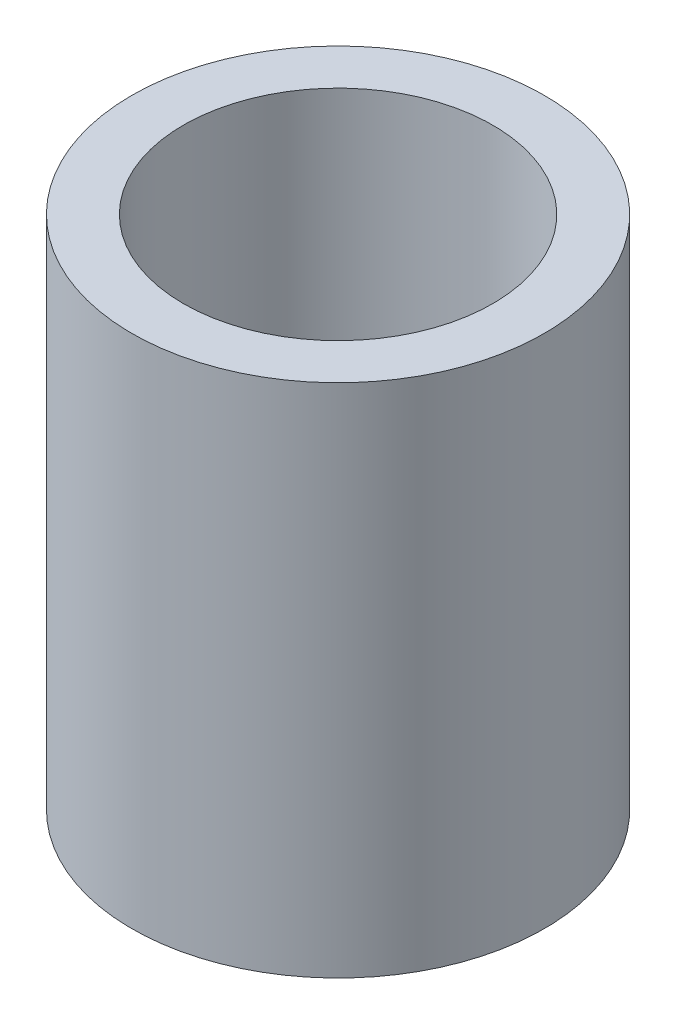
ISO-10303-21;
HEADER;
FILE_DESCRIPTION(('STEP AP214'),'2;1');
FILE_NAME('part.step','',(''),(''),'','','');
FILE_SCHEMA(('AUTOMOTIVE_DESIGN { 1 0 10303 214 1 1 1 1 }'));
ENDSEC;
DATA;
#1=APPLICATION_CONTEXT('core data for automotive mechanical design processes');
#2=APPLICATION_PROTOCOL_DEFINITION('international standard','automotive_design',2000,#1);
#3=PRODUCT_CONTEXT('',#1,'mechanical');
#4=PRODUCT('Part','Part','',(#3));
#5=PRODUCT_RELATED_PRODUCT_CATEGORY('part','',(#4));
#6=PRODUCT_DEFINITION_FORMATION('','',#4);
#7=PRODUCT_DEFINITION_CONTEXT('part definition',#1,'design');
#8=PRODUCT_DEFINITION('design','',#6,#7);
#9=PRODUCT_DEFINITION_SHAPE('','',#8);
#10=(LENGTH_UNIT() NAMED_UNIT(*) SI_UNIT(.MILLI.,.METRE.));
#11=(NAMED_UNIT(*) PLANE_ANGLE_UNIT() SI_UNIT($,.RADIAN.));
#12=(NAMED_UNIT(*) SI_UNIT($,.STERADIAN.) SOLID_ANGLE_UNIT());
#13=UNCERTAINTY_MEASURE_WITH_UNIT(LENGTH_MEASURE(1.E-05),#10,'distance_accuracy_value','');
#14=(GEOMETRIC_REPRESENTATION_CONTEXT(3) GLOBAL_UNCERTAINTY_ASSIGNED_CONTEXT((#13)) GLOBAL_UNIT_ASSIGNED_CONTEXT((#10,
#11,#12)) REPRESENTATION_CONTEXT('',''));
#15=CARTESIAN_POINT('',(0.,0.,0.));
#16=DIRECTION('',(0.,0.,1.));
#17=DIRECTION('',(1.,0.,0.));
#18=AXIS2_PLACEMENT_3D('',#15,#16,#17);
#19=CARTESIAN_POINT('',(0.,-16.2609134615385,0.));
#20=DIRECTION('',(0.,1.,0.));
#21=DIRECTION('',(-1.,0.,0.));
#22=AXIS2_PLACEMENT_3D('',#19,#20,#21);
#23=PLANE('',#22);
#24=CARTESIAN_POINT('',(0.000522643364028914,-16.2609134615385,0.));
#25=DIRECTION('',(0.,1.,0.));
#26=DIRECTION('',(-1.,0.,0.));
#27=AXIS2_PLACEMENT_3D('',#24,#25,#26);
#28=CIRCLE('',#27,3.);
#29=CARTESIAN_POINT('',(0.000522643364028914,-16.2609134615385,3.));
#30=VERTEX_POINT('',#29);
#31=EDGE_CURVE('E34',#30,#30,#28,.F.);
#32=ORIENTED_EDGE('',*,*,#31,.T.);
#33=EDGE_LOOP('',(#32));
#34=FACE_BOUND('',#33,.T.);
#35=CARTESIAN_POINT('',(0.,-16.2609134615385,0.));
#36=DIRECTION('',(0.,1.,0.));
#37=DIRECTION('',(-1.,0.,0.));
#38=AXIS2_PLACEMENT_3D('',#35,#36,#37);
#39=CIRCLE('',#38,4.);
#40=CARTESIAN_POINT('',(-4.,-16.2609134615385,0.));
#41=VERTEX_POINT('',#40);
#42=EDGE_CURVE('E10',#41,#41,#39,.T.);
#43=ORIENTED_EDGE('',*,*,#42,.T.);
#44=EDGE_LOOP('',(#43));
#45=FACE_BOUND('',#44,.T.);
#46=ADVANCED_FACE('F31',(#34,#45),#23,.T.);
#47=CARTESIAN_POINT('',(0.,-16.2609134615385,0.));
#48=DIRECTION('',(0.,1.,0.));
#49=DIRECTION('',(-1.,0.,0.));
#50=AXIS2_PLACEMENT_3D('',#47,#48,#49);
#51=CYLINDRICAL_SURFACE('',#50,4.);
#52=CARTESIAN_POINT('',(0.,-26.2609134615385,0.));
#53=DIRECTION('',(0.,1.,0.));
#54=DIRECTION('',(-1.,0.,0.));
#55=AXIS2_PLACEMENT_3D('',#52,#53,#54);
#56=CIRCLE('',#55,4.);
#57=CARTESIAN_POINT('',(-4.,-26.2609134615385,0.));
#58=VERTEX_POINT('',#57);
#59=EDGE_CURVE('E38',#58,#58,#56,.T.);
#60=ORIENTED_EDGE('',*,*,#59,.T.);
#61=EDGE_LOOP('',(#60));
#62=FACE_BOUND('',#61,.T.);
#63=ORIENTED_EDGE('',*,*,#42,.F.);
#64=EDGE_LOOP('',(#63));
#65=FACE_BOUND('',#64,.T.);
#66=ADVANCED_FACE('F63',(#62,#65),#51,.T.);
#67=CARTESIAN_POINT('',(-4.,-26.2609134615385,0.));
#68=DIRECTION('',(0.,-1.,0.));
#69=DIRECTION('',(1.,0.,0.));
#70=AXIS2_PLACEMENT_3D('',#67,#68,#69);
#71=PLANE('',#70);
#72=ORIENTED_EDGE('',*,*,#59,.F.);
#73=EDGE_LOOP('',(#72));
#74=FACE_BOUND('',#73,.T.);
#75=ADVANCED_FACE('F55',(#74),#71,.T.);
#76=CARTESIAN_POINT('',(0.000522643364028914,-25.,0.));
#77=DIRECTION('',(0.,1.,0.));
#78=DIRECTION('',(0.,0.,1.));
#79=AXIS2_PLACEMENT_3D('',#76,#77,#78);
#80=CYLINDRICAL_SURFACE('',#79,3.);
#81=CARTESIAN_POINT('',(0.000522643364028914,-25.,0.));
#82=DIRECTION('',(0.,1.,0.));
#83=DIRECTION('',(0.,0.,1.));
#84=AXIS2_PLACEMENT_3D('',#81,#82,#83);
#85=CIRCLE('',#84,3.);
#86=CARTESIAN_POINT('',(0.000522643364028914,-25.,3.));
#87=VERTEX_POINT('',#86);
#88=EDGE_CURVE('E44',#87,#87,#85,.F.);
#89=CARTESIAN_POINT('',(0.000522643364028914,-16.2609134615385,3.));
#90=CARTESIAN_POINT('',(0.000522643364028914,-16.3519456129808,3.));
#91=CARTESIAN_POINT('',(0.000522643364028914,-16.4429777644231,3.));
#92=CARTESIAN_POINT('',(0.000522643364028914,-16.6250420673077,3.));
#93=CARTESIAN_POINT('',(0.000522643364028914,-16.71607421875,3.));
#94=CARTESIAN_POINT('',(0.000522643364028914,-16.8981385216346,3.));
#95=CARTESIAN_POINT('',(0.000522643364028914,-16.9891706730769,3.));
#96=CARTESIAN_POINT('',(0.000522643364028914,-17.1712349759615,3.));
#97=CARTESIAN_POINT('',(0.000522643364028914,-17.2622671274039,3.));
#98=CARTESIAN_POINT('',(0.000522643364028914,-17.4443314302885,3.));
#99=CARTESIAN_POINT('',(0.000522643364028914,-17.5353635817308,3.));
#100=CARTESIAN_POINT('',(0.000522643364028914,-17.7174278846154,3.));
#101=CARTESIAN_POINT('',(0.000522643364028914,-17.8084600360577,3.));
#102=CARTESIAN_POINT('',(0.000522643364028914,-17.9905243389423,3.));
#103=CARTESIAN_POINT('',(0.000522643364028914,-18.0815564903846,3.));
#104=CARTESIAN_POINT('',(0.000522643364028914,-18.2636207932692,3.));
#105=CARTESIAN_POINT('',(0.000522643364028914,-18.3546529447115,3.));
#106=CARTESIAN_POINT('',(0.000522643364028914,-18.5367172475962,3.));
#107=CARTESIAN_POINT('',(0.000522643364028914,-18.6277493990385,3.));
#108=CARTESIAN_POINT('',(0.000522643364028914,-18.8098137019231,3.));
#109=CARTESIAN_POINT('',(0.000522643364028914,-18.9008458533654,3.));
#110=CARTESIAN_POINT('',(0.000522643364028914,-19.08291015625,3.));
#111=CARTESIAN_POINT('',(0.000522643364028914,-19.1739423076923,3.));
#112=CARTESIAN_POINT('',(0.000522643364028914,-19.3560066105769,3.));
#113=CARTESIAN_POINT('',(0.000522643364028914,-19.4470387620192,3.));
#114=CARTESIAN_POINT('',(0.000522643364028914,-19.6291030649039,3.));
#115=CARTESIAN_POINT('',(0.000522643364028914,-19.7201352163462,3.));
#116=CARTESIAN_POINT('',(0.000522643364028914,-19.9021995192308,3.));
#117=CARTESIAN_POINT('',(0.000522643364028914,-19.9932316706731,3.));
#118=CARTESIAN_POINT('',(0.000522643364028914,-20.1752959735577,3.));
#119=CARTESIAN_POINT('',(0.000522643364028914,-20.266328125,3.));
#120=CARTESIAN_POINT('',(0.000522643364028914,-20.4483924278846,3.));
#121=CARTESIAN_POINT('',(0.000522643364028914,-20.5394245793269,3.));
#122=CARTESIAN_POINT('',(0.000522643364028914,-20.7214888822115,3.));
#123=CARTESIAN_POINT('',(0.000522643364028914,-20.8125210336539,3.));
#124=CARTESIAN_POINT('',(0.000522643364028914,-20.9945853365385,3.));
#125=CARTESIAN_POINT('',(0.000522643364028914,-21.0856174879808,3.));
#126=CARTESIAN_POINT('',(0.000522643364028914,-21.2676817908654,3.));
#127=CARTESIAN_POINT('',(0.000522643364028914,-21.3587139423077,3.));
#128=CARTESIAN_POINT('',(0.000522643364028914,-21.5407782451923,3.));
#129=CARTESIAN_POINT('',(0.000522643364028914,-21.6318103966346,3.));
#130=CARTESIAN_POINT('',(0.000522643364028914,-21.8138746995192,3.));
#131=CARTESIAN_POINT('',(0.000522643364028914,-21.9049068509615,3.));
#132=CARTESIAN_POINT('',(0.000522643364028914,-22.0869711538462,3.));
#133=CARTESIAN_POINT('',(0.000522643364028914,-22.1780033052885,3.));
#134=CARTESIAN_POINT('',(0.000522643364028914,-22.3600676081731,3.));
#135=CARTESIAN_POINT('',(0.000522643364028914,-22.4510997596154,3.));
#136=CARTESIAN_POINT('',(0.000522643364028914,-22.6331640625,3.));
#137=CARTESIAN_POINT('',(0.000522643364028914,-22.7241962139423,3.));
#138=CARTESIAN_POINT('',(0.000522643364028914,-22.9062605168269,3.));
#139=CARTESIAN_POINT('',(0.000522643364028914,-22.9972926682692,3.));
#140=CARTESIAN_POINT('',(0.000522643364028914,-23.1793569711539,3.));
#141=CARTESIAN_POINT('',(0.000522643364028914,-23.2703891225962,3.));
#142=CARTESIAN_POINT('',(0.000522643364028914,-23.4524534254808,3.));
#143=CARTESIAN_POINT('',(0.000522643364028914,-23.5434855769231,3.));
#144=CARTESIAN_POINT('',(0.000522643364028914,-23.7255498798077,3.));
#145=CARTESIAN_POINT('',(0.000522643364028914,-23.81658203125,3.));
#146=CARTESIAN_POINT('',(0.000522643364028914,-23.9986463341346,3.));
#147=CARTESIAN_POINT('',(0.000522643364028914,-24.0896784855769,3.));
#148=CARTESIAN_POINT('',(0.000522643364028914,-24.2717427884616,3.));
#149=CARTESIAN_POINT('',(0.000522643364028914,-24.3627749399039,3.));
#150=CARTESIAN_POINT('',(0.000522643364028914,-24.5448392427885,3.));
#151=CARTESIAN_POINT('',(0.000522643364028914,-24.6358713942308,3.));
#152=CARTESIAN_POINT('',(0.000522643364028914,-24.8179356971154,3.));
#153=CARTESIAN_POINT('',(0.000522643364028914,-24.9089678485577,3.));
#154=CARTESIAN_POINT('',(0.000522643364028914,-25.,3.));
#155=B_SPLINE_CURVE_WITH_KNOTS('',3,(#89,#90,#91,#92,#93,#94,#95,#96,#97,#98,#99,#100,#101,#102,
#103,#104,#105,#106,#107,#108,#109,#110,#111,#112,#113,#114,#115,#116,#117,#118,#119,#120,#121,
#122,#123,#124,#125,#126,#127,#128,#129,#130,#131,#132,#133,#134,#135,#136,#137,#138,#139,#140,
#141,#142,#143,#144,#145,#146,#147,#148,#149,#150,#151,#152,#153,#154),.UNSPECIFIED.,.F.,.F.,(4,
2,2,2,2,2,2,2,2,2,2,2,2,2,2,2,2,2,2,2,2,2,2,2,2,2,2,2,2,2,2,2,4),(0.,0.273096454326924,
0.546192908653848,0.819289362980771,1.0923858173077,1.36548227163462,1.63857872596154,
1.91167518028846,2.18477163461539,2.45786808894231,2.73096454326923,3.00406099759616,
3.27715745192308,3.55025390625,3.82335036057693,4.09644681490385,4.36954326923077,
4.6426397235577,4.91573617788462,5.18883263221154,5.46192908653846,5.73502554086539,
6.00812199519231,6.28121844951924,6.55431490384616,6.82741135817308,7.1005078125,
7.37360426682693,7.64670072115385,7.91979717548077,8.1928936298077,8.46599008413462,
8.73908653846154),.UNSPECIFIED.);
#156=EDGE_CURVE('BSEAM52',#30,#87,#155,.T.);
#157=ORIENTED_EDGE('',*,*,#31,.F.);
#158=ORIENTED_EDGE('',*,*,#88,.T.);
#159=ORIENTED_EDGE('',*,*,#156,.T.);
#160=ORIENTED_EDGE('',*,*,#156,.F.);
#161=EDGE_LOOP('',(#157,#159,#158,#160));
#162=FACE_BOUND('',#161,.T.);
#163=ADVANCED_FACE('F52',(#162),#80,.F.);
#164=CARTESIAN_POINT('',(0.,-25.,0.));
#165=DIRECTION('',(0.,1.,0.));
#166=DIRECTION('',(0.,0.,1.));
#167=AXIS2_PLACEMENT_3D('',#164,#165,#166);
#168=PLANE('',#167);
#169=ORIENTED_EDGE('',*,*,#88,.F.);
#170=EDGE_LOOP('',(#169));
#171=FACE_BOUND('',#170,.T.);
#172=ADVANCED_FACE('F54',(#171),#168,.T.);
#173=CLOSED_SHELL('',(#46,#66,#75,#163,#172));
#174=MANIFOLD_SOLID_BREP('B2',#173);
#175=ADVANCED_BREP_SHAPE_REPRESENTATION('',(#18,#174),#14);
#176=SHAPE_DEFINITION_REPRESENTATION(#9,#175);
ENDSEC;
END-ISO-10303-21;
